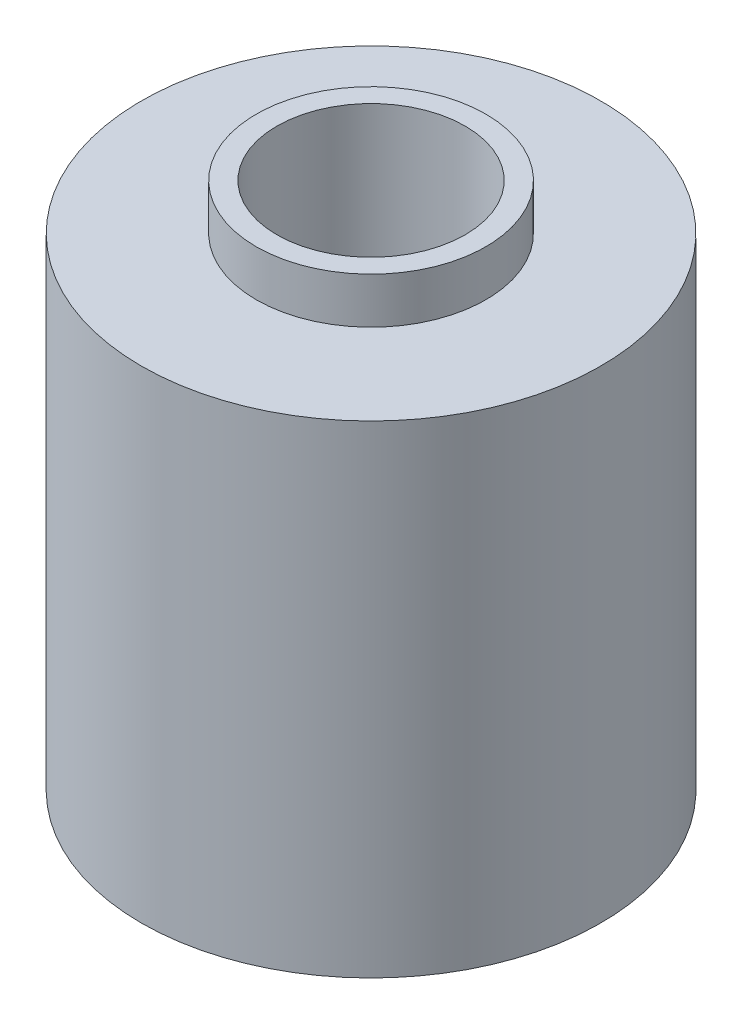
ISO-10303-21;
HEADER;
FILE_DESCRIPTION(('STEP AP214'),'2;1');
FILE_NAME('part.step','',(''),(''),'','','');
FILE_SCHEMA(('AUTOMOTIVE_DESIGN { 1 0 10303 214 1 1 1 1 }'));
ENDSEC;
DATA;
#1=APPLICATION_CONTEXT('core data for automotive mechanical design processes');
#2=APPLICATION_PROTOCOL_DEFINITION('international standard','automotive_design',2000,#1);
#3=PRODUCT_CONTEXT('',#1,'mechanical');
#4=PRODUCT('Part','Part','',(#3));
#5=PRODUCT_RELATED_PRODUCT_CATEGORY('part','',(#4));
#6=PRODUCT_DEFINITION_FORMATION('','',#4);
#7=PRODUCT_DEFINITION_CONTEXT('part definition',#1,'design');
#8=PRODUCT_DEFINITION('design','',#6,#7);
#9=PRODUCT_DEFINITION_SHAPE('','',#8);
#10=(LENGTH_UNIT() NAMED_UNIT(*) SI_UNIT(.MILLI.,.METRE.));
#11=(NAMED_UNIT(*) PLANE_ANGLE_UNIT() SI_UNIT($,.RADIAN.));
#12=(NAMED_UNIT(*) SI_UNIT($,.STERADIAN.) SOLID_ANGLE_UNIT());
#13=UNCERTAINTY_MEASURE_WITH_UNIT(LENGTH_MEASURE(1.E-05),#10,'distance_accuracy_value','');
#14=(GEOMETRIC_REPRESENTATION_CONTEXT(3) GLOBAL_UNCERTAINTY_ASSIGNED_CONTEXT((#13)) GLOBAL_UNIT_ASSIGNED_CONTEXT((#10,
#11,#12)) REPRESENTATION_CONTEXT('',''));
#15=CARTESIAN_POINT('',(0.,0.,0.));
#16=DIRECTION('',(0.,0.,1.));
#17=DIRECTION('',(1.,0.,0.));
#18=AXIS2_PLACEMENT_3D('',#15,#16,#17);
#19=CARTESIAN_POINT('',(0.,12.5,-4.1));
#20=DIRECTION('',(0.,-1.,0.));
#21=DIRECTION('',(0.,0.,-1.));
#22=AXIS2_PLACEMENT_3D('',#19,#20,#21);
#23=PLANE('',#22);
#24=CARTESIAN_POINT('',(0.,12.5,0.));
#25=DIRECTION('',(0.,1.,0.));
#26=DIRECTION('',(0.,0.,1.));
#27=AXIS2_PLACEMENT_3D('',#24,#25,#26);
#28=CIRCLE('',#27,4.1);
#29=CARTESIAN_POINT('',(0.,12.5,4.1));
#30=VERTEX_POINT('',#29);
#31=EDGE_CURVE('E59',#30,#30,#28,.T.);
#32=ORIENTED_EDGE('',*,*,#31,.F.);
#33=EDGE_LOOP('',(#32));
#34=FACE_BOUND('',#33,.T.);
#35=CARTESIAN_POINT('',(0.,12.5,0.));
#36=DIRECTION('',(0.,1.,0.));
#37=DIRECTION('',(0.,0.,1.));
#38=AXIS2_PLACEMENT_3D('',#35,#36,#37);
#39=CIRCLE('',#38,5.00000000000001);
#40=CARTESIAN_POINT('',(0.,12.5,5.00000000000001));
#41=VERTEX_POINT('',#40);
#42=EDGE_CURVE('E10',#41,#41,#39,.T.);
#43=ORIENTED_EDGE('',*,*,#42,.T.);
#44=EDGE_LOOP('',(#43));
#45=FACE_BOUND('',#44,.T.);
#46=ADVANCED_FACE('F31',(#34,#45),#23,.F.);
#47=CARTESIAN_POINT('',(0.,30.4346153846154,0.));
#48=DIRECTION('',(0.,1.,0.));
#49=DIRECTION('',(0.,0.,1.));
#50=AXIS2_PLACEMENT_3D('',#47,#48,#49);
#51=CYLINDRICAL_SURFACE('',#50,5.00000000000001);
#52=ORIENTED_EDGE('',*,*,#42,.F.);
#53=EDGE_LOOP('',(#52));
#54=FACE_BOUND('',#53,.T.);
#55=CARTESIAN_POINT('',(0.,10.5,0.));
#56=DIRECTION('',(0.,1.,0.));
#57=DIRECTION('',(0.,0.,1.));
#58=AXIS2_PLACEMENT_3D('',#55,#56,#57);
#59=CIRCLE('',#58,5.00000000000001);
#60=CARTESIAN_POINT('',(0.,10.5,5.00000000000001));
#61=VERTEX_POINT('',#60);
#62=EDGE_CURVE('E37',#61,#61,#59,.T.);
#63=ORIENTED_EDGE('',*,*,#62,.T.);
#64=EDGE_LOOP('',(#63));
#65=FACE_BOUND('',#64,.T.);
#66=ADVANCED_FACE('F66',(#54,#65),#51,.T.);
#67=CARTESIAN_POINT('',(0.,10.5,-5.00000000000001));
#68=DIRECTION('',(0.,-1.,0.));
#69=DIRECTION('',(0.,0.,-1.));
#70=AXIS2_PLACEMENT_3D('',#67,#68,#69);
#71=PLANE('',#70);
#72=ORIENTED_EDGE('',*,*,#62,.F.);
#73=EDGE_LOOP('',(#72));
#74=FACE_BOUND('',#73,.T.);
#75=CARTESIAN_POINT('',(0.,10.5,0.));
#76=DIRECTION('',(0.,1.,0.));
#77=DIRECTION('',(0.,0.,1.));
#78=AXIS2_PLACEMENT_3D('',#75,#76,#77);
#79=CIRCLE('',#78,10.);
#80=CARTESIAN_POINT('',(0.,10.5,10.));
#81=VERTEX_POINT('',#80);
#82=EDGE_CURVE('E41',#81,#81,#79,.T.);
#83=ORIENTED_EDGE('',*,*,#82,.T.);
#84=EDGE_LOOP('',(#83));
#85=FACE_BOUND('',#84,.T.);
#86=ADVANCED_FACE('F70',(#74,#85),#71,.F.);
#87=CARTESIAN_POINT('',(0.,30.4346153846154,0.));
#88=DIRECTION('',(0.,1.,0.));
#89=DIRECTION('',(0.,0.,1.));
#90=AXIS2_PLACEMENT_3D('',#87,#88,#89);
#91=CYLINDRICAL_SURFACE('',#90,10.);
#92=ORIENTED_EDGE('',*,*,#82,.F.);
#93=EDGE_LOOP('',(#92));
#94=FACE_BOUND('',#93,.T.);
#95=CARTESIAN_POINT('',(0.,-10.5,0.));
#96=DIRECTION('',(0.,1.,0.));
#97=DIRECTION('',(0.,0.,1.));
#98=AXIS2_PLACEMENT_3D('',#95,#96,#97);
#99=CIRCLE('',#98,10.);
#100=CARTESIAN_POINT('',(0.,-10.5,10.));
#101=VERTEX_POINT('',#100);
#102=EDGE_CURVE('E45',#101,#101,#99,.T.);
#103=ORIENTED_EDGE('',*,*,#102,.T.);
#104=EDGE_LOOP('',(#103));
#105=FACE_BOUND('',#104,.T.);
#106=ADVANCED_FACE('F75',(#94,#105),#91,.T.);
#107=CARTESIAN_POINT('',(0.,-10.5,-10.));
#108=DIRECTION('',(0.,1.,0.));
#109=DIRECTION('',(0.,0.,1.));
#110=AXIS2_PLACEMENT_3D('',#107,#108,#109);
#111=PLANE('',#110);
#112=ORIENTED_EDGE('',*,*,#102,.F.);
#113=EDGE_LOOP('',(#112));
#114=FACE_BOUND('',#113,.T.);
#115=CARTESIAN_POINT('',(0.,-10.5,0.));
#116=DIRECTION('',(0.,1.,0.));
#117=DIRECTION('',(0.,0.,1.));
#118=AXIS2_PLACEMENT_3D('',#115,#116,#117);
#119=CIRCLE('',#118,5.00000000000001);
#120=CARTESIAN_POINT('',(0.,-10.5,5.00000000000001));
#121=VERTEX_POINT('',#120);
#122=EDGE_CURVE('E50',#121,#121,#119,.T.);
#123=ORIENTED_EDGE('',*,*,#122,.T.);
#124=EDGE_LOOP('',(#123));
#125=FACE_BOUND('',#124,.T.);
#126=ADVANCED_FACE('F81',(#114,#125),#111,.F.);
#127=CARTESIAN_POINT('',(0.,30.4346153846154,0.));
#128=DIRECTION('',(0.,1.,0.));
#129=DIRECTION('',(0.,0.,1.));
#130=AXIS2_PLACEMENT_3D('',#127,#128,#129);
#131=CYLINDRICAL_SURFACE('',#130,5.00000000000001);
#132=ORIENTED_EDGE('',*,*,#122,.F.);
#133=EDGE_LOOP('',(#132));
#134=FACE_BOUND('',#133,.T.);
#135=CARTESIAN_POINT('',(0.,-12.5,0.));
#136=DIRECTION('',(0.,1.,0.));
#137=DIRECTION('',(0.,0.,1.));
#138=AXIS2_PLACEMENT_3D('',#135,#136,#137);
#139=CIRCLE('',#138,5.00000000000001);
#140=CARTESIAN_POINT('',(0.,-12.5,5.00000000000001));
#141=VERTEX_POINT('',#140);
#142=EDGE_CURVE('E53',#141,#141,#139,.T.);
#143=ORIENTED_EDGE('',*,*,#142,.T.);
#144=EDGE_LOOP('',(#143));
#145=FACE_BOUND('',#144,.T.);
#146=ADVANCED_FACE('F85',(#134,#145),#131,.T.);
#147=CARTESIAN_POINT('',(0.,-12.5,-5.00000000000001));
#148=DIRECTION('',(0.,1.,0.));
#149=DIRECTION('',(0.,0.,1.));
#150=AXIS2_PLACEMENT_3D('',#147,#148,#149);
#151=PLANE('',#150);
#152=ORIENTED_EDGE('',*,*,#142,.F.);
#153=EDGE_LOOP('',(#152));
#154=FACE_BOUND('',#153,.T.);
#155=CARTESIAN_POINT('',(0.,-12.5,0.));
#156=DIRECTION('',(0.,1.,0.));
#157=DIRECTION('',(0.,0.,1.));
#158=AXIS2_PLACEMENT_3D('',#155,#156,#157);
#159=CIRCLE('',#158,4.1);
#160=CARTESIAN_POINT('',(0.,-12.5,4.1));
#161=VERTEX_POINT('',#160);
#162=EDGE_CURVE('E56',#161,#161,#159,.T.);
#163=ORIENTED_EDGE('',*,*,#162,.T.);
#164=EDGE_LOOP('',(#163));
#165=FACE_BOUND('',#164,.T.);
#166=ADVANCED_FACE('F89',(#154,#165),#151,.F.);
#167=CARTESIAN_POINT('',(0.,30.4346153846154,0.));
#168=DIRECTION('',(0.,1.,0.));
#169=DIRECTION('',(0.,0.,1.));
#170=AXIS2_PLACEMENT_3D('',#167,#168,#169);
#171=CYLINDRICAL_SURFACE('',#170,4.1);
#172=ORIENTED_EDGE('',*,*,#162,.F.);
#173=EDGE_LOOP('',(#172));
#174=FACE_BOUND('',#173,.T.);
#175=ORIENTED_EDGE('',*,*,#31,.T.);
#176=EDGE_LOOP('',(#175));
#177=FACE_BOUND('',#176,.T.);
#178=ADVANCED_FACE('F63',(#174,#177),#171,.F.);
#179=CLOSED_SHELL('',(#46,#66,#86,#106,#126,#146,#166,#178));
#180=MANIFOLD_SOLID_BREP('B2',#179);
#181=ADVANCED_BREP_SHAPE_REPRESENTATION('',(#18,#180),#14);
#182=SHAPE_DEFINITION_REPRESENTATION(#9,#181);
ENDSEC;
END-ISO-10303-21;
